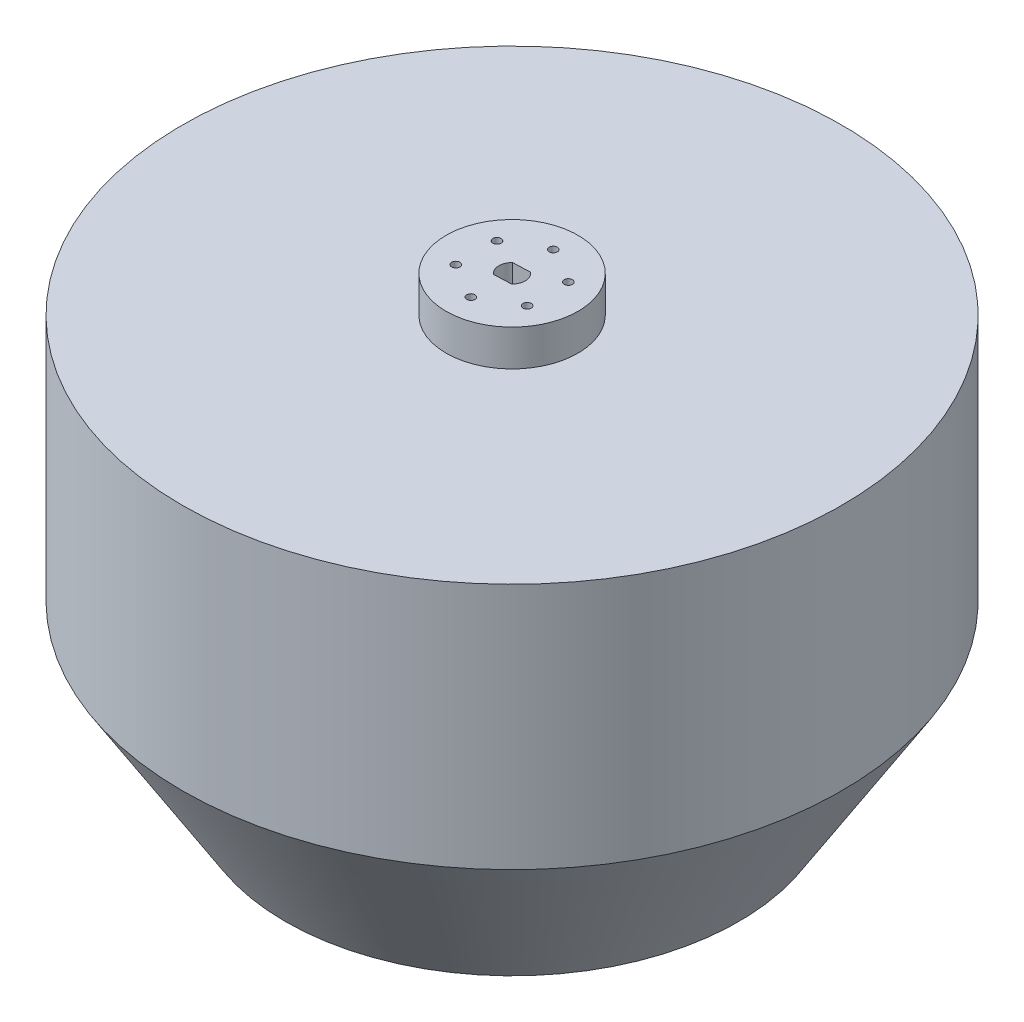
ISO-10303-21;
HEADER;
FILE_DESCRIPTION(('STEP AP214'),'2;1');
FILE_NAME('part.step','',(''),(''),'','','');
FILE_SCHEMA(('AUTOMOTIVE_DESIGN { 1 0 10303 214 1 1 1 1 }'));
ENDSEC;
DATA;
#1=APPLICATION_CONTEXT('core data for automotive mechanical design processes');
#2=APPLICATION_PROTOCOL_DEFINITION('international standard','automotive_design',2000,#1);
#3=PRODUCT_CONTEXT('',#1,'mechanical');
#4=PRODUCT('Part','Part','',(#3));
#5=PRODUCT_RELATED_PRODUCT_CATEGORY('part','',(#4));
#6=PRODUCT_DEFINITION_FORMATION('','',#4);
#7=PRODUCT_DEFINITION_CONTEXT('part definition',#1,'design');
#8=PRODUCT_DEFINITION('design','',#6,#7);
#9=PRODUCT_DEFINITION_SHAPE('','',#8);
#10=(LENGTH_UNIT() NAMED_UNIT(*) SI_UNIT(.MILLI.,.METRE.));
#11=(NAMED_UNIT(*) PLANE_ANGLE_UNIT() SI_UNIT($,.RADIAN.));
#12=(NAMED_UNIT(*) SI_UNIT($,.STERADIAN.) SOLID_ANGLE_UNIT());
#13=UNCERTAINTY_MEASURE_WITH_UNIT(LENGTH_MEASURE(1.E-05),#10,'distance_accuracy_value','');
#14=(GEOMETRIC_REPRESENTATION_CONTEXT(3) GLOBAL_UNCERTAINTY_ASSIGNED_CONTEXT((#13)) GLOBAL_UNIT_ASSIGNED_CONTEXT((#10,
#11,#12)) REPRESENTATION_CONTEXT('',''));
#15=CARTESIAN_POINT('',(0.,0.,0.));
#16=DIRECTION('',(0.,0.,1.));
#17=DIRECTION('',(1.,0.,0.));
#18=AXIS2_PLACEMENT_3D('',#15,#16,#17);
#19=CARTESIAN_POINT('',(0.,57.3492996881719,0.));
#20=DIRECTION('',(0.,1.,0.));
#21=DIRECTION('',(0.,0.,1.));
#22=AXIS2_PLACEMENT_3D('',#19,#20,#21);
#23=CYLINDRICAL_SURFACE('',#22,97.5);
#24=CARTESIAN_POINT('',(0.,11.2433603046011,0.));
#25=DIRECTION('',(0.,-1.,0.));
#26=DIRECTION('',(0.,0.,-1.));
#27=AXIS2_PLACEMENT_3D('',#24,#25,#26);
#28=CIRCLE('',#27,97.5);
#29=CARTESIAN_POINT('',(0.,11.2433603046011,-97.5));
#30=VERTEX_POINT('',#29);
#31=EDGE_CURVE('E157',#30,#30,#28,.T.);
#32=ORIENTED_EDGE('',*,*,#31,.F.);
#33=EDGE_LOOP('',(#32));
#34=FACE_BOUND('',#33,.T.);
#35=CARTESIAN_POINT('',(0.,25.2294928136093,0.));
#36=DIRECTION('',(0.,1.,0.));
#37=DIRECTION('',(0.,0.,1.));
#38=AXIS2_PLACEMENT_3D('',#35,#36,#37);
#39=CIRCLE('',#38,97.5);
#40=CARTESIAN_POINT('',(0.,25.2294928136093,97.5));
#41=VERTEX_POINT('',#40);
#42=EDGE_CURVE('E167',#41,#41,#39,.T.);
#43=ORIENTED_EDGE('',*,*,#42,.F.);
#44=EDGE_LOOP('',(#43));
#45=FACE_BOUND('',#44,.T.);
#46=ADVANCED_FACE('F37',(#34,#45),#23,.T.);
#47=CARTESIAN_POINT('',(0.,45.2294928136093,0.));
#48=DIRECTION('',(0.,1.,0.));
#49=DIRECTION('',(0.,0.,1.));
#50=AXIS2_PLACEMENT_3D('',#47,#48,#49);
#51=PLANE('',#50);
#52=CARTESIAN_POINT('',(0.,45.2294928136093,0.));
#53=DIRECTION('',(0.,1.,0.));
#54=DIRECTION('',(0.,0.,1.));
#55=AXIS2_PLACEMENT_3D('',#52,#53,#54);
#56=CIRCLE('',#55,40.);
#57=CARTESIAN_POINT('',(0.,45.2294928136093,40.));
#58=VERTEX_POINT('',#57);
#59=EDGE_CURVE('E11',#58,#58,#56,.T.);
#60=ORIENTED_EDGE('',*,*,#59,.F.);
#61=EDGE_LOOP('',(#60));
#62=FACE_BOUND('',#61,.T.);
#63=CARTESIAN_POINT('',(0.,45.2294928136093,0.));
#64=DIRECTION('',(0.,1.,0.));
#65=DIRECTION('',(0.,0.,1.));
#66=AXIS2_PLACEMENT_3D('',#63,#64,#65);
#67=CIRCLE('',#66,200.);
#68=CARTESIAN_POINT('',(0.,45.2294928136093,200.));
#69=VERTEX_POINT('',#68);
#70=EDGE_CURVE('E46',#69,#69,#67,.T.);
#71=ORIENTED_EDGE('',*,*,#70,.T.);
#72=EDGE_LOOP('',(#71));
#73=FACE_BOUND('',#72,.T.);
#74=ADVANCED_FACE('F39',(#62,#73),#51,.T.);
#75=CARTESIAN_POINT('',(0.,57.3492996881719,0.));
#76=DIRECTION('',(0.,1.,0.));
#77=DIRECTION('',(0.,0.,1.));
#78=AXIS2_PLACEMENT_3D('',#75,#76,#77);
#79=CYLINDRICAL_SURFACE('',#78,200.);
#80=CARTESIAN_POINT('',(0.,-104.770507186391,0.));
#81=DIRECTION('',(0.,1.,0.));
#82=DIRECTION('',(0.,0.,1.));
#83=AXIS2_PLACEMENT_3D('',#80,#81,#82);
#84=CIRCLE('',#83,200.);
#85=CARTESIAN_POINT('',(0.,-104.770507186391,200.));
#86=VERTEX_POINT('',#85);
#87=EDGE_CURVE('E182',#86,#86,#84,.T.);
#88=ORIENTED_EDGE('',*,*,#87,.T.);
#89=EDGE_LOOP('',(#88));
#90=FACE_BOUND('',#89,.T.);
#91=ORIENTED_EDGE('',*,*,#70,.F.);
#92=EDGE_LOOP('',(#91));
#93=FACE_BOUND('',#92,.T.);
#94=ADVANCED_FACE('F225',(#90,#93),#79,.T.);
#95=CARTESIAN_POINT('',(0.,-104.770507186391,0.));
#96=DIRECTION('',(0.,1.,0.));
#97=DIRECTION('',(0.,0.,1.));
#98=AXIS2_PLACEMENT_3D('',#95,#96,#97);
#99=CONICAL_SURFACE('',#98,200.,0.558599315343562);
#100=CARTESIAN_POINT('',(0.,-204.770507186391,0.));
#101=DIRECTION('',(0.,1.,0.));
#102=DIRECTION('',(0.,0.,1.));
#103=AXIS2_PLACEMENT_3D('',#100,#101,#102);
#104=CIRCLE('',#103,137.5);
#105=CARTESIAN_POINT('',(0.,-204.770507186391,137.5));
#106=VERTEX_POINT('',#105);
#107=EDGE_CURVE('E179',#106,#106,#104,.T.);
#108=ORIENTED_EDGE('',*,*,#107,.T.);
#109=EDGE_LOOP('',(#108));
#110=FACE_BOUND('',#109,.T.);
#111=ORIENTED_EDGE('',*,*,#87,.F.);
#112=EDGE_LOOP('',(#111));
#113=FACE_BOUND('',#112,.T.);
#114=ADVANCED_FACE('F219',(#110,#113),#99,.T.);
#115=CARTESIAN_POINT('',(-137.5,-204.770507186391,0.));
#116=DIRECTION('',(0.,-1.,0.));
#117=DIRECTION('',(0.,0.,-1.));
#118=AXIS2_PLACEMENT_3D('',#115,#116,#117);
#119=PLANE('',#118);
#120=CARTESIAN_POINT('',(0.,-204.770507186391,0.));
#121=DIRECTION('',(0.,1.,0.));
#122=DIRECTION('',(0.,0.,1.));
#123=AXIS2_PLACEMENT_3D('',#120,#121,#122);
#124=CIRCLE('',#123,117.5);
#125=CARTESIAN_POINT('',(0.,-204.770507186391,117.5));
#126=VERTEX_POINT('',#125);
#127=EDGE_CURVE('E176',#126,#126,#124,.T.);
#128=ORIENTED_EDGE('',*,*,#127,.T.);
#129=EDGE_LOOP('',(#128));
#130=FACE_BOUND('',#129,.T.);
#131=ORIENTED_EDGE('',*,*,#107,.F.);
#132=EDGE_LOOP('',(#131));
#133=FACE_BOUND('',#132,.T.);
#134=ADVANCED_FACE('F213',(#130,#133),#119,.T.);
#135=CARTESIAN_POINT('',(0.,-204.770507186391,0.));
#136=DIRECTION('',(0.,1.,0.));
#137=DIRECTION('',(0.,0.,1.));
#138=AXIS2_PLACEMENT_3D('',#135,#136,#137);
#139=CONICAL_SURFACE('',#138,117.5,0.558599315343563);
#140=CARTESIAN_POINT('',(0.,-104.770507186391,0.));
#141=DIRECTION('',(0.,1.,0.));
#142=DIRECTION('',(0.,0.,1.));
#143=AXIS2_PLACEMENT_3D('',#140,#141,#142);
#144=CIRCLE('',#143,180.);
#145=CARTESIAN_POINT('',(0.,-104.770507186391,180.));
#146=VERTEX_POINT('',#145);
#147=EDGE_CURVE('E173',#146,#146,#144,.T.);
#148=ORIENTED_EDGE('',*,*,#147,.T.);
#149=EDGE_LOOP('',(#148));
#150=FACE_BOUND('',#149,.T.);
#151=ORIENTED_EDGE('',*,*,#127,.F.);
#152=EDGE_LOOP('',(#151));
#153=FACE_BOUND('',#152,.T.);
#154=ADVANCED_FACE('F207',(#150,#153),#139,.F.);
#155=CARTESIAN_POINT('',(0.,57.3492996881719,0.));
#156=DIRECTION('',(0.,1.,0.));
#157=DIRECTION('',(0.,0.,1.));
#158=AXIS2_PLACEMENT_3D('',#155,#156,#157);
#159=CYLINDRICAL_SURFACE('',#158,180.);
#160=CARTESIAN_POINT('',(0.,25.2294928136093,0.));
#161=DIRECTION('',(0.,1.,0.));
#162=DIRECTION('',(0.,0.,1.));
#163=AXIS2_PLACEMENT_3D('',#160,#161,#162);
#164=CIRCLE('',#163,180.);
#165=CARTESIAN_POINT('',(0.,25.2294928136093,180.));
#166=VERTEX_POINT('',#165);
#167=EDGE_CURVE('E170',#166,#166,#164,.T.);
#168=ORIENTED_EDGE('',*,*,#167,.T.);
#169=EDGE_LOOP('',(#168));
#170=FACE_BOUND('',#169,.T.);
#171=ORIENTED_EDGE('',*,*,#147,.F.);
#172=EDGE_LOOP('',(#171));
#173=FACE_BOUND('',#172,.T.);
#174=ADVANCED_FACE('F201',(#170,#173),#159,.F.);
#175=CARTESIAN_POINT('',(-180.,25.2294928136093,0.));
#176=DIRECTION('',(0.,-1.,0.));
#177=DIRECTION('',(0.,0.,-1.));
#178=AXIS2_PLACEMENT_3D('',#175,#176,#177);
#179=PLANE('',#178);
#180=ORIENTED_EDGE('',*,*,#42,.T.);
#181=EDGE_LOOP('',(#180));
#182=FACE_BOUND('',#181,.T.);
#183=ORIENTED_EDGE('',*,*,#167,.F.);
#184=EDGE_LOOP('',(#183));
#185=FACE_BOUND('',#184,.T.);
#186=ADVANCED_FACE('F198',(#182,#185),#179,.T.);
#187=CARTESIAN_POINT('',(0.,4.25029405009688,0.));
#188=DIRECTION('',(0.,1.,0.));
#189=DIRECTION('',(0.,0.,1.));
#190=AXIS2_PLACEMENT_3D('',#187,#188,#189);
#191=TOROIDAL_SURFACE('',#190,107.860840909893,12.5);
#192=ORIENTED_EDGE('',*,*,#31,.T.);
#193=EDGE_LOOP('',(#192));
#194=FACE_BOUND('',#193,.T.);
#195=CARTESIAN_POINT('',(0.,-2.7427722044073,0.));
#196=DIRECTION('',(0.,1.,0.));
#197=DIRECTION('',(0.,0.,1.));
#198=AXIS2_PLACEMENT_3D('',#195,#196,#197);
#199=CIRCLE('',#198,97.5);
#200=CARTESIAN_POINT('',(0.,-2.7427722044073,97.5));
#201=VERTEX_POINT('',#200);
#202=EDGE_CURVE('E158',#201,#201,#199,.T.);
#203=ORIENTED_EDGE('',*,*,#202,.T.);
#204=EDGE_LOOP('',(#203));
#205=FACE_BOUND('',#204,.T.);
#206=ADVANCED_FACE('F189',(#194,#205),#191,.F.);
#207=CARTESIAN_POINT('',(0.,-9.73583845891146,0.));
#208=DIRECTION('',(0.,1.,0.));
#209=DIRECTION('',(0.,0.,1.));
#210=AXIS2_PLACEMENT_3D('',#207,#208,#209);
#211=TOROIDAL_SURFACE('',#210,107.860840909893,12.5);
#212=ORIENTED_EDGE('',*,*,#202,.F.);
#213=EDGE_LOOP('',(#212));
#214=FACE_BOUND('',#213,.T.);
#215=CARTESIAN_POINT('',(0.,-16.7289047134156,0.));
#216=DIRECTION('',(0.,-1.,0.));
#217=DIRECTION('',(0.,0.,-1.));
#218=AXIS2_PLACEMENT_3D('',#215,#216,#217);
#219=CIRCLE('',#218,97.5000000000001);
#220=CARTESIAN_POINT('',(0.,-16.7289047134156,-97.5000000000001));
#221=VERTEX_POINT('',#220);
#222=EDGE_CURVE('E154',#221,#221,#219,.T.);
#223=ORIENTED_EDGE('',*,*,#222,.F.);
#224=EDGE_LOOP('',(#223));
#225=FACE_BOUND('',#224,.T.);
#226=ADVANCED_FACE('F318',(#214,#225),#211,.F.);
#227=CARTESIAN_POINT('',(0.,-23.7219709679198,0.));
#228=DIRECTION('',(0.,1.,0.));
#229=DIRECTION('',(0.,0.,1.));
#230=AXIS2_PLACEMENT_3D('',#227,#228,#229);
#231=TOROIDAL_SURFACE('',#230,107.860840909893,12.5);
#232=ORIENTED_EDGE('',*,*,#222,.T.);
#233=EDGE_LOOP('',(#232));
#234=FACE_BOUND('',#233,.T.);
#235=CARTESIAN_POINT('',(0.,-30.715037222424,0.));
#236=DIRECTION('',(0.,1.,0.));
#237=DIRECTION('',(0.,0.,1.));
#238=AXIS2_PLACEMENT_3D('',#235,#236,#237);
#239=CIRCLE('',#238,97.5);
#240=CARTESIAN_POINT('',(0.,-30.715037222424,97.5));
#241=VERTEX_POINT('',#240);
#242=EDGE_CURVE('E161',#241,#241,#239,.T.);
#243=ORIENTED_EDGE('',*,*,#242,.T.);
#244=EDGE_LOOP('',(#243));
#245=FACE_BOUND('',#244,.T.);
#246=ADVANCED_FACE('F321',(#234,#245),#231,.F.);
#247=CARTESIAN_POINT('',(0.,-37.7081034769281,0.));
#248=DIRECTION('',(0.,1.,0.));
#249=DIRECTION('',(0.,0.,1.));
#250=AXIS2_PLACEMENT_3D('',#247,#248,#249);
#251=TOROIDAL_SURFACE('',#250,107.860840909893,12.5);
#252=ORIENTED_EDGE('',*,*,#242,.F.);
#253=EDGE_LOOP('',(#252));
#254=FACE_BOUND('',#253,.T.);
#255=CARTESIAN_POINT('',(0.,-44.7011697314323,0.));
#256=DIRECTION('',(0.,1.,0.));
#257=DIRECTION('',(0.,0.,1.));
#258=AXIS2_PLACEMENT_3D('',#255,#256,#257);
#259=CIRCLE('',#258,97.5);
#260=CARTESIAN_POINT('',(0.,-44.7011697314323,97.5));
#261=VERTEX_POINT('',#260);
#262=EDGE_CURVE('E146',#261,#261,#259,.T.);
#263=ORIENTED_EDGE('',*,*,#262,.T.);
#264=EDGE_LOOP('',(#263));
#265=FACE_BOUND('',#264,.T.);
#266=ADVANCED_FACE('F305',(#254,#265),#251,.F.);
#267=CARTESIAN_POINT('',(0.,-51.6942359859364,0.));
#268=DIRECTION('',(0.,1.,0.));
#269=DIRECTION('',(0.,0.,1.));
#270=AXIS2_PLACEMENT_3D('',#267,#268,#269);
#271=TOROIDAL_SURFACE('',#270,107.860840909893,12.5);
#272=ORIENTED_EDGE('',*,*,#262,.F.);
#273=EDGE_LOOP('',(#272));
#274=FACE_BOUND('',#273,.T.);
#275=CARTESIAN_POINT('',(0.,-58.6873022404406,0.));
#276=DIRECTION('',(0.,1.,0.));
#277=DIRECTION('',(0.,0.,1.));
#278=AXIS2_PLACEMENT_3D('',#275,#276,#277);
#279=CIRCLE('',#278,97.5);
#280=CARTESIAN_POINT('',(0.,-58.6873022404406,97.5));
#281=VERTEX_POINT('',#280);
#282=EDGE_CURVE('E143',#281,#281,#279,.T.);
#283=ORIENTED_EDGE('',*,*,#282,.T.);
#284=EDGE_LOOP('',(#283));
#285=FACE_BOUND('',#284,.T.);
#286=ADVANCED_FACE('F301',(#274,#285),#271,.F.);
#287=CARTESIAN_POINT('',(0.,-65.6803684949447,0.));
#288=DIRECTION('',(0.,1.,0.));
#289=DIRECTION('',(0.,0.,1.));
#290=AXIS2_PLACEMENT_3D('',#287,#288,#289);
#291=TOROIDAL_SURFACE('',#290,107.860840909893,12.5);
#292=ORIENTED_EDGE('',*,*,#282,.F.);
#293=EDGE_LOOP('',(#292));
#294=FACE_BOUND('',#293,.T.);
#295=CARTESIAN_POINT('',(0.,-72.6734347494489,0.));
#296=DIRECTION('',(0.,1.,0.));
#297=DIRECTION('',(0.,0.,1.));
#298=AXIS2_PLACEMENT_3D('',#295,#296,#297);
#299=CIRCLE('',#298,97.5);
#300=CARTESIAN_POINT('',(0.,-72.6734347494489,97.5));
#301=VERTEX_POINT('',#300);
#302=EDGE_CURVE('E142',#301,#301,#299,.T.);
#303=ORIENTED_EDGE('',*,*,#302,.T.);
#304=EDGE_LOOP('',(#303));
#305=FACE_BOUND('',#304,.T.);
#306=ADVANCED_FACE('F304',(#294,#305),#291,.F.);
#307=CARTESIAN_POINT('',(0.,-93.6526335129613,0.));
#308=DIRECTION('',(0.,1.,0.));
#309=DIRECTION('',(0.,0.,1.));
#310=AXIS2_PLACEMENT_3D('',#307,#308,#309);
#311=TOROIDAL_SURFACE('',#310,107.860840909893,12.5);
#312=CARTESIAN_POINT('',(0.,-100.645699767465,0.));
#313=DIRECTION('',(0.,1.,0.));
#314=DIRECTION('',(0.,0.,1.));
#315=AXIS2_PLACEMENT_3D('',#312,#313,#314);
#316=CIRCLE('',#315,97.5);
#317=CARTESIAN_POINT('',(0.,-100.645699767465,97.5));
#318=VERTEX_POINT('',#317);
#319=EDGE_CURVE('E41',#318,#318,#316,.T.);
#320=ORIENTED_EDGE('',*,*,#319,.T.);
#321=EDGE_LOOP('',(#320));
#322=FACE_BOUND('',#321,.T.);
#323=CARTESIAN_POINT('',(0.,-86.6595672584572,0.));
#324=DIRECTION('',(0.,1.,0.));
#325=DIRECTION('',(0.,0.,1.));
#326=AXIS2_PLACEMENT_3D('',#323,#324,#325);
#327=CIRCLE('',#326,97.5);
#328=CARTESIAN_POINT('',(0.,-86.6595672584572,97.5));
#329=VERTEX_POINT('',#328);
#330=EDGE_CURVE('E149',#329,#329,#327,.T.);
#331=ORIENTED_EDGE('',*,*,#330,.F.);
#332=EDGE_LOOP('',(#331));
#333=FACE_BOUND('',#332,.T.);
#334=ADVANCED_FACE('F307',(#322,#333),#311,.F.);
#335=CARTESIAN_POINT('',(0.,-79.666501003953,0.));
#336=DIRECTION('',(0.,1.,0.));
#337=DIRECTION('',(0.,0.,1.));
#338=AXIS2_PLACEMENT_3D('',#335,#336,#337);
#339=TOROIDAL_SURFACE('',#338,107.860840909893,12.5);
#340=ORIENTED_EDGE('',*,*,#302,.F.);
#341=EDGE_LOOP('',(#340));
#342=FACE_BOUND('',#341,.T.);
#343=ORIENTED_EDGE('',*,*,#330,.T.);
#344=EDGE_LOOP('',(#343));
#345=FACE_BOUND('',#344,.T.);
#346=ADVANCED_FACE('F310',(#342,#345),#339,.F.);
#347=ORIENTED_EDGE('',*,*,#319,.F.);
#348=EDGE_LOOP('',(#347));
#349=FACE_BOUND('',#348,.T.);
#350=CARTESIAN_POINT('',(0.,-104.770507186391,0.));
#351=DIRECTION('',(0.,-1.,0.));
#352=DIRECTION('',(0.,0.,-1.));
#353=AXIS2_PLACEMENT_3D('',#350,#351,#352);
#354=CIRCLE('',#353,97.5);
#355=CARTESIAN_POINT('',(0.,-104.770507186391,-97.5));
#356=VERTEX_POINT('',#355);
#357=EDGE_CURVE('E139',#356,#356,#354,.T.);
#358=ORIENTED_EDGE('',*,*,#357,.F.);
#359=EDGE_LOOP('',(#358));
#360=FACE_BOUND('',#359,.T.);
#361=ADVANCED_FACE('F195',(#349,#360),#23,.T.);
#362=CARTESIAN_POINT('',(0.,-117.117992442394,0.));
#363=DIRECTION('',(0.,1.,0.));
#364=DIRECTION('',(0.,0.,1.));
#365=AXIS2_PLACEMENT_3D('',#362,#363,#364);
#366=TOROIDAL_SURFACE('',#365,99.4466915145426,12.5);
#367=ORIENTED_EDGE('',*,*,#357,.T.);
#368=EDGE_LOOP('',(#367));
#369=FACE_BOUND('',#368,.T.);
#370=CARTESIAN_POINT('',(0.,-120.77885315948,0.));
#371=DIRECTION('',(0.,1.,0.));
#372=DIRECTION('',(0.,0.,1.));
#373=AXIS2_PLACEMENT_3D('',#370,#371,#372);
#374=CIRCLE('',#373,87.4947837668191);
#375=CARTESIAN_POINT('',(0.,-120.77885315948,87.4947837668191));
#376=VERTEX_POINT('',#375);
#377=EDGE_CURVE('E133',#376,#376,#374,.T.);
#378=ORIENTED_EDGE('',*,*,#377,.T.);
#379=EDGE_LOOP('',(#378));
#380=FACE_BOUND('',#379,.T.);
#381=ADVANCED_FACE('F290',(#369,#380),#366,.F.);
#382=CARTESIAN_POINT('',(0.,-133.126338415483,0.));
#383=DIRECTION('',(0.,1.,0.));
#384=DIRECTION('',(0.,0.,1.));
#385=AXIS2_PLACEMENT_3D('',#382,#383,#384);
#386=TOROIDAL_SURFACE('',#385,89.4414752813618,12.5);
#387=ORIENTED_EDGE('',*,*,#377,.F.);
#388=EDGE_LOOP('',(#387));
#389=FACE_BOUND('',#388,.T.);
#390=CARTESIAN_POINT('',(0.,-136.787199132569,0.));
#391=DIRECTION('',(0.,1.,0.));
#392=DIRECTION('',(0.,0.,1.));
#393=AXIS2_PLACEMENT_3D('',#390,#391,#392);
#394=CIRCLE('',#393,77.4895675336383);
#395=CARTESIAN_POINT('',(0.,-136.787199132569,77.4895675336383));
#396=VERTEX_POINT('',#395);
#397=EDGE_CURVE('E136',#396,#396,#394,.T.);
#398=ORIENTED_EDGE('',*,*,#397,.T.);
#399=EDGE_LOOP('',(#398));
#400=FACE_BOUND('',#399,.T.);
#401=ADVANCED_FACE('F287',(#389,#400),#386,.F.);
#402=CARTESIAN_POINT('',(0.,-149.134684388572,0.));
#403=DIRECTION('',(0.,1.,0.));
#404=DIRECTION('',(0.,0.,1.));
#405=AXIS2_PLACEMENT_3D('',#402,#403,#404);
#406=TOROIDAL_SURFACE('',#405,79.436259048181,12.5);
#407=ORIENTED_EDGE('',*,*,#397,.F.);
#408=EDGE_LOOP('',(#407));
#409=FACE_BOUND('',#408,.T.);
#410=CARTESIAN_POINT('',(0.,-152.795545105659,0.));
#411=DIRECTION('',(0.,1.,0.));
#412=DIRECTION('',(0.,0.,1.));
#413=AXIS2_PLACEMENT_3D('',#410,#411,#412);
#414=CIRCLE('',#413,67.4843513004574);
#415=CARTESIAN_POINT('',(0.,-152.795545105659,67.4843513004574));
#416=VERTEX_POINT('',#415);
#417=EDGE_CURVE('E127',#416,#416,#414,.T.);
#418=ORIENTED_EDGE('',*,*,#417,.T.);
#419=EDGE_LOOP('',(#418));
#420=FACE_BOUND('',#419,.T.);
#421=ADVANCED_FACE('F285',(#409,#420),#406,.F.);
#422=CARTESIAN_POINT('',(0.,-165.143030361662,0.));
#423=DIRECTION('',(0.,1.,0.));
#424=DIRECTION('',(0.,0.,1.));
#425=AXIS2_PLACEMENT_3D('',#422,#423,#424);
#426=TOROIDAL_SURFACE('',#425,69.4310428150001,12.5);
#427=ORIENTED_EDGE('',*,*,#417,.F.);
#428=EDGE_LOOP('',(#427));
#429=FACE_BOUND('',#428,.T.);
#430=CARTESIAN_POINT('',(0.,-168.803891078748,0.));
#431=DIRECTION('',(0.,1.,0.));
#432=DIRECTION('',(0.,0.,1.));
#433=AXIS2_PLACEMENT_3D('',#430,#431,#432);
#434=CIRCLE('',#433,57.4791350672766);
#435=CARTESIAN_POINT('',(0.,-168.803891078748,57.4791350672766));
#436=VERTEX_POINT('',#435);
#437=EDGE_CURVE('E130',#436,#436,#434,.T.);
#438=ORIENTED_EDGE('',*,*,#437,.T.);
#439=EDGE_LOOP('',(#438));
#440=FACE_BOUND('',#439,.T.);
#441=ADVANCED_FACE('F282',(#429,#440),#426,.F.);
#442=CARTESIAN_POINT('',(0.,-181.151376334751,0.));
#443=DIRECTION('',(0.,1.,0.));
#444=DIRECTION('',(0.,0.,1.));
#445=AXIS2_PLACEMENT_3D('',#442,#443,#444);
#446=TOROIDAL_SURFACE('',#445,59.4258265818192,12.5);
#447=ORIENTED_EDGE('',*,*,#437,.F.);
#448=EDGE_LOOP('',(#447));
#449=FACE_BOUND('',#448,.T.);
#450=CARTESIAN_POINT('',(0.,-184.812237051837,0.));
#451=DIRECTION('',(0.,1.,0.));
#452=DIRECTION('',(0.,0.,1.));
#453=AXIS2_PLACEMENT_3D('',#450,#451,#452);
#454=CIRCLE('',#453,47.4739188340957);
#455=CARTESIAN_POINT('',(0.,-184.812237051837,47.4739188340957));
#456=VERTEX_POINT('',#455);
#457=EDGE_CURVE('E120',#456,#456,#454,.T.);
#458=ORIENTED_EDGE('',*,*,#457,.T.);
#459=EDGE_LOOP('',(#458));
#460=FACE_BOUND('',#459,.T.);
#461=ADVANCED_FACE('F280',(#449,#460),#446,.F.);
#462=CARTESIAN_POINT('',(0.,-197.15972230784,0.));
#463=DIRECTION('',(0.,1.,0.));
#464=DIRECTION('',(0.,0.,1.));
#465=AXIS2_PLACEMENT_3D('',#462,#463,#464);
#466=TOROIDAL_SURFACE('',#465,49.4206103486384,12.5);
#467=CARTESIAN_POINT('',(0.,-200.820583024927,0.));
#468=DIRECTION('',(0.,1.,0.));
#469=DIRECTION('',(0.,0.,1.));
#470=AXIS2_PLACEMENT_3D('',#467,#468,#469);
#471=CIRCLE('',#470,37.4687026009149);
#472=CARTESIAN_POINT('',(0.,-200.820583024927,37.4687026009149));
#473=VERTEX_POINT('',#472);
#474=EDGE_CURVE('E124',#473,#473,#471,.T.);
#475=ORIENTED_EDGE('',*,*,#474,.T.);
#476=EDGE_LOOP('',(#475));
#477=FACE_BOUND('',#476,.T.);
#478=ORIENTED_EDGE('',*,*,#457,.F.);
#479=EDGE_LOOP('',(#478));
#480=FACE_BOUND('',#479,.T.);
#481=ADVANCED_FACE('F276',(#477,#480),#466,.F.);
#482=CARTESIAN_POINT('',(-35.,-204.770507186391,0.));
#483=DIRECTION('',(0.,-1.,0.));
#484=DIRECTION('',(0.,0.,-1.));
#485=AXIS2_PLACEMENT_3D('',#482,#483,#484);
#486=PLANE('',#485);
#487=CARTESIAN_POINT('',(0.,-204.770507186391,0.));
#488=DIRECTION('',(0.,1.,0.));
#489=DIRECTION('',(0.,0.,1.));
#490=AXIS2_PLACEMENT_3D('',#487,#488,#489);
#491=CIRCLE('',#490,35.);
#492=CARTESIAN_POINT('',(0.,-204.770507186391,35.));
#493=VERTEX_POINT('',#492);
#494=EDGE_CURVE('E164',#493,#493,#491,.T.);
#495=ORIENTED_EDGE('',*,*,#494,.F.);
#496=EDGE_LOOP('',(#495));
#497=FACE_BOUND('',#496,.T.);
#498=ADVANCED_FACE('F279',(#497),#486,.T.);
#499=CARTESIAN_POINT('',(0.,-104.770507186391,0.));
#500=DIRECTION('',(0.,1.,0.));
#501=DIRECTION('',(0.,0.,1.));
#502=AXIS2_PLACEMENT_3D('',#499,#500,#501);
#503=CONICAL_SURFACE('',#502,97.5,0.558599315343563);
#504=ORIENTED_EDGE('',*,*,#474,.F.);
#505=EDGE_LOOP('',(#504));
#506=FACE_BOUND('',#505,.T.);
#507=ORIENTED_EDGE('',*,*,#494,.T.);
#508=EDGE_LOOP('',(#507));
#509=FACE_BOUND('',#508,.T.);
#510=ADVANCED_FACE('F271',(#506,#509),#503,.T.);
#511=CARTESIAN_POINT('',(0.,67.2294928136094,0.));
#512=DIRECTION('',(0.,1.,0.));
#513=DIRECTION('',(0.,0.,1.));
#514=AXIS2_PLACEMENT_3D('',#511,#512,#513);
#515=PLANE('',#514);
#516=CARTESIAN_POINT('',(1.28326169135384E-12,67.2294928136094,-24.9999999999977));
#517=DIRECTION('',(0.,1.,0.));
#518=DIRECTION('',(0.,0.,1.));
#519=AXIS2_PLACEMENT_3D('',#516,#517,#518);
#520=CIRCLE('',#519,2.49999999999875);
#521=CARTESIAN_POINT('',(1.28326169135384E-12,67.2294928136094,-22.499999999999));
#522=VERTEX_POINT('',#521);
#523=EDGE_CURVE('E540',#522,#522,#520,.T.);
#524=ORIENTED_EDGE('',*,*,#523,.F.);
#525=EDGE_LOOP('',(#524));
#526=FACE_BOUND('',#525,.T.);
#527=CARTESIAN_POINT('',(-21.6506350946084,67.2294928136094,-12.4999999999979));
#528=DIRECTION('',(0.,1.,0.));
#529=DIRECTION('',(0.,0.,1.));
#530=AXIS2_PLACEMENT_3D('',#527,#528,#529);
#531=CIRCLE('',#530,2.50000000000107);
#532=CARTESIAN_POINT('',(-21.6506350946084,67.2294928136094,-9.9999999999968));
#533=VERTEX_POINT('',#532);
#534=EDGE_CURVE('E550',#533,#533,#531,.T.);
#535=ORIENTED_EDGE('',*,*,#534,.F.);
#536=EDGE_LOOP('',(#535));
#537=FACE_BOUND('',#536,.T.);
#538=CARTESIAN_POINT('',(-21.6506350946079,67.2294928136094,12.5000000000009));
#539=DIRECTION('',(0.,1.,0.));
#540=DIRECTION('',(0.,0.,1.));
#541=AXIS2_PLACEMENT_3D('',#538,#539,#540);
#542=CIRCLE('',#541,2.5000000000024);
#543=CARTESIAN_POINT('',(-21.6506350946079,67.2294928136094,15.0000000000033));
#544=VERTEX_POINT('',#543);
#545=EDGE_CURVE('E549',#544,#544,#542,.T.);
#546=ORIENTED_EDGE('',*,*,#545,.F.);
#547=EDGE_LOOP('',(#546));
#548=FACE_BOUND('',#547,.T.);
#549=CARTESIAN_POINT('',(2.26418693175979E-12,67.2294928136094,24.9999999999999));
#550=DIRECTION('',(0.,1.,0.));
#551=DIRECTION('',(0.,0.,1.));
#552=AXIS2_PLACEMENT_3D('',#549,#550,#551);
#553=CIRCLE('',#552,2.50000000000167);
#554=CARTESIAN_POINT('',(2.26418693175979E-12,67.2294928136094,27.5000000000016));
#555=VERTEX_POINT('',#554);
#556=EDGE_CURVE('E567',#555,#555,#553,.T.);
#557=ORIENTED_EDGE('',*,*,#556,.F.);
#558=EDGE_LOOP('',(#557));
#559=FACE_BOUND('',#558,.T.);
#560=CARTESIAN_POINT('',(21.6506350946119,67.2294928136094,12.5000000000001));
#561=DIRECTION('',(0.,1.,0.));
#562=DIRECTION('',(0.,0.,1.));
#563=AXIS2_PLACEMENT_3D('',#560,#561,#562);
#564=CIRCLE('',#563,2.49999999999958);
#565=CARTESIAN_POINT('',(21.6506350946119,67.2294928136094,14.9999999999996));
#566=VERTEX_POINT('',#565);
#567=EDGE_CURVE('E561',#566,#566,#564,.T.);
#568=ORIENTED_EDGE('',*,*,#567,.F.);
#569=EDGE_LOOP('',(#568));
#570=FACE_BOUND('',#569,.T.);
#571=CARTESIAN_POINT('',(21.6506350946114,67.2294928136094,-12.4999999999987));
#572=DIRECTION('',(0.,1.,0.));
#573=DIRECTION('',(0.,0.,1.));
#574=AXIS2_PLACEMENT_3D('',#571,#572,#573);
#575=CIRCLE('',#574,2.49999999999814);
#576=CARTESIAN_POINT('',(21.6506350946114,67.2294928136094,-10.0000000000006));
#577=VERTEX_POINT('',#576);
#578=EDGE_CURVE('E555',#577,#577,#575,.T.);
#579=ORIENTED_EDGE('',*,*,#578,.F.);
#580=EDGE_LOOP('',(#579));
#581=FACE_BOUND('',#580,.T.);
#582=CARTESIAN_POINT('',(0.,67.2294928136094,0.));
#583=DIRECTION('',(0.,1.,0.));
#584=DIRECTION('',(0.,0.,1.));
#585=AXIS2_PLACEMENT_3D('',#582,#583,#584);
#586=CIRCLE('',#585,40.);
#587=CARTESIAN_POINT('',(0.,67.2294928136094,40.));
#588=VERTEX_POINT('',#587);
#589=EDGE_CURVE('E95',#588,#588,#586,.T.);
#590=ORIENTED_EDGE('',*,*,#589,.T.);
#591=EDGE_LOOP('',(#590));
#592=FACE_BOUND('',#591,.T.);
#593=DIRECTION('',(0.999231298525374,0.,-0.0392021944193863));
#594=VECTOR('',#593,1.);
#595=CARTESIAN_POINT('',(5.52264820277606,67.2294928136094,5.78794927658744));
#596=LINE('',#595,#594);
#597=CARTESIAN_POINT('',(-5.05222186974509,67.2294928136094,6.20282630571424));
#598=VERTEX_POINT('',#597);
#599=CARTESIAN_POINT('',(5.52264820277681,67.2294928136094,5.78794927658822));
#600=VERTEX_POINT('',#599);
#601=EDGE_CURVE('E87',#598,#600,#596,.T.);
#602=ORIENTED_EDGE('',*,*,#601,.F.);
#603=CARTESIAN_POINT('',(0.,67.2294928136094,0.));
#604=DIRECTION('',(0.,1.,0.));
#605=DIRECTION('',(0.,0.,1.));
#606=AXIS2_PLACEMENT_3D('',#603,#604,#605);
#607=CIRCLE('',#606,8.00000000000053);
#608=CARTESIAN_POINT('',(-5.52264820277773,67.2294928136094,-5.78794927659025));
#609=VERTEX_POINT('',#608);
#610=EDGE_CURVE('E79',#609,#598,#607,.T.);
#611=ORIENTED_EDGE('',*,*,#610,.F.);
#612=DIRECTION('',(-0.999231298525374,0.,0.0392021944193863));
#613=VECTOR('',#612,1.);
#614=CARTESIAN_POINT('',(-5.52264820277773,67.2294928136094,-5.78794927659025));
#615=LINE('',#614,#613);
#616=CARTESIAN_POINT('',(5.05222186974343,67.2294928136094,-6.20282630571705));
#617=VERTEX_POINT('',#616);
#618=EDGE_CURVE('E102',#617,#609,#615,.T.);
#619=ORIENTED_EDGE('',*,*,#618,.F.);
#620=CARTESIAN_POINT('',(0.,67.2294928136094,0.));
#621=DIRECTION('',(0.,1.,0.));
#622=DIRECTION('',(0.,0.,1.));
#623=AXIS2_PLACEMENT_3D('',#620,#621,#622);
#624=CIRCLE('',#623,7.9999999999995);
#625=EDGE_CURVE('E100',#600,#617,#624,.T.);
#626=ORIENTED_EDGE('',*,*,#625,.F.);
#627=EDGE_LOOP('',(#602,#611,#619,#626));
#628=FACE_BOUND('',#627,.T.);
#629=ADVANCED_FACE('F99',(#526,#537,#548,#559,#570,#581,#592,#628),#515,.T.);
#630=CARTESIAN_POINT('',(0.,67.2294928136094,0.));
#631=DIRECTION('',(0.,-1.,0.));
#632=DIRECTION('',(0.,0.,-1.));
#633=AXIS2_PLACEMENT_3D('',#630,#631,#632);
#634=CYLINDRICAL_SURFACE('',#633,40.);
#635=ORIENTED_EDGE('',*,*,#589,.F.);
#636=EDGE_LOOP('',(#635));
#637=FACE_BOUND('',#636,.T.);
#638=ORIENTED_EDGE('',*,*,#59,.T.);
#639=EDGE_LOOP('',(#638));
#640=FACE_BOUND('',#639,.T.);
#641=ADVANCED_FACE('F268',(#637,#640),#634,.T.);
#642=CARTESIAN_POINT('',(0.,67.2294928136094,0.));
#643=DIRECTION('',(0.,-1.,0.));
#644=DIRECTION('',(0.,0.,-1.));
#645=AXIS2_PLACEMENT_3D('',#642,#643,#644);
#646=CYLINDRICAL_SURFACE('',#645,8.00000000000053);
#647=CARTESIAN_POINT('',(0.,45.2294928136093,0.));
#648=DIRECTION('',(0.,1.,0.));
#649=DIRECTION('',(0.,0.,1.));
#650=AXIS2_PLACEMENT_3D('',#647,#648,#649);
#651=CIRCLE('',#650,8.00000000000053);
#652=CARTESIAN_POINT('',(-5.52264820277773,45.2294928136093,-5.78794927659025));
#653=VERTEX_POINT('',#652);
#654=CARTESIAN_POINT('',(-5.05222186974509,45.2294928136093,6.20282630571424));
#655=VERTEX_POINT('',#654);
#656=EDGE_CURVE('E107',#653,#655,#651,.T.);
#657=ORIENTED_EDGE('',*,*,#656,.F.);
#658=DIRECTION('',(0.,-1.,0.));
#659=VECTOR('',#658,1.);
#660=CARTESIAN_POINT('',(-5.52264820277773,67.2294928136094,-5.78794927659025));
#661=LINE('',#660,#659);
#662=EDGE_CURVE('E54',#609,#653,#661,.T.);
#663=ORIENTED_EDGE('',*,*,#662,.F.);
#664=ORIENTED_EDGE('',*,*,#610,.T.);
#665=DIRECTION('',(0.,-1.,0.));
#666=VECTOR('',#665,1.);
#667=CARTESIAN_POINT('',(-5.05222186974509,67.2294928136094,6.20282630571424));
#668=LINE('',#667,#666);
#669=EDGE_CURVE('E82',#598,#655,#668,.T.);
#670=ORIENTED_EDGE('',*,*,#669,.T.);
#671=EDGE_LOOP('',(#657,#663,#664,#670));
#672=FACE_BOUND('',#671,.T.);
#673=ADVANCED_FACE('F81',(#672),#646,.F.);
#674=CARTESIAN_POINT('',(5.52264820277606,67.2294928136094,5.78794927658744));
#675=DIRECTION('',(-0.0392021944193863,0.,-0.999231298525374));
#676=DIRECTION('',(-0.999231298525374,0.,0.0392021944193863));
#677=AXIS2_PLACEMENT_3D('',#674,#675,#676);
#678=PLANE('',#677);
#679=DIRECTION('',(0.999231298525374,0.,-0.0392021944193863));
#680=VECTOR('',#679,1.);
#681=CARTESIAN_POINT('',(5.52264820277606,45.2294928136093,5.78794927658744));
#682=LINE('',#681,#680);
#683=CARTESIAN_POINT('',(5.52264820277681,45.2294928136093,5.78794927658822));
#684=VERTEX_POINT('',#683);
#685=EDGE_CURVE('E94',#655,#684,#682,.T.);
#686=ORIENTED_EDGE('',*,*,#685,.F.);
#687=ORIENTED_EDGE('',*,*,#669,.F.);
#688=ORIENTED_EDGE('',*,*,#601,.T.);
#689=DIRECTION('',(0.,-1.,0.));
#690=VECTOR('',#689,1.);
#691=CARTESIAN_POINT('',(5.52264820277681,67.2294928136094,5.78794927658822));
#692=LINE('',#691,#690);
#693=EDGE_CURVE('E96',#600,#684,#692,.T.);
#694=ORIENTED_EDGE('',*,*,#693,.T.);
#695=EDGE_LOOP('',(#686,#687,#688,#694));
#696=FACE_BOUND('',#695,.T.);
#697=ADVANCED_FACE('F91',(#696),#678,.T.);
#698=CARTESIAN_POINT('',(0.,67.2294928136094,0.));
#699=DIRECTION('',(0.,-1.,0.));
#700=DIRECTION('',(0.,0.,-1.));
#701=AXIS2_PLACEMENT_3D('',#698,#699,#700);
#702=CYLINDRICAL_SURFACE('',#701,7.9999999999995);
#703=CARTESIAN_POINT('',(0.,45.2294928136093,0.));
#704=DIRECTION('',(0.,1.,0.));
#705=DIRECTION('',(0.,0.,1.));
#706=AXIS2_PLACEMENT_3D('',#703,#704,#705);
#707=CIRCLE('',#706,7.9999999999995);
#708=CARTESIAN_POINT('',(5.05222186974343,45.2294928136093,-6.20282630571705));
#709=VERTEX_POINT('',#708);
#710=EDGE_CURVE('E111',#684,#709,#707,.T.);
#711=ORIENTED_EDGE('',*,*,#710,.F.);
#712=ORIENTED_EDGE('',*,*,#693,.F.);
#713=ORIENTED_EDGE('',*,*,#625,.T.);
#714=DIRECTION('',(0.,-1.,0.));
#715=VECTOR('',#714,1.);
#716=CARTESIAN_POINT('',(5.05222186974343,67.2294928136094,-6.20282630571705));
#717=LINE('',#716,#715);
#718=EDGE_CURVE('E59',#617,#709,#717,.T.);
#719=ORIENTED_EDGE('',*,*,#718,.T.);
#720=EDGE_LOOP('',(#711,#712,#713,#719));
#721=FACE_BOUND('',#720,.T.);
#722=ADVANCED_FACE('F254',(#721),#702,.F.);
#723=CARTESIAN_POINT('',(-5.52264820277773,67.2294928136094,-5.78794927659025));
#724=DIRECTION('',(0.0392021944193863,0.,0.999231298525374));
#725=DIRECTION('',(0.999231298525374,0.,-0.0392021944193863));
#726=AXIS2_PLACEMENT_3D('',#723,#724,#725);
#727=PLANE('',#726);
#728=DIRECTION('',(-0.999231298525374,0.,0.0392021944193863));
#729=VECTOR('',#728,1.);
#730=CARTESIAN_POINT('',(-5.52264820277773,45.2294928136093,-5.78794927659025));
#731=LINE('',#730,#729);
#732=EDGE_CURVE('E88',#709,#653,#731,.T.);
#733=ORIENTED_EDGE('',*,*,#732,.F.);
#734=ORIENTED_EDGE('',*,*,#718,.F.);
#735=ORIENTED_EDGE('',*,*,#618,.T.);
#736=ORIENTED_EDGE('',*,*,#662,.T.);
#737=EDGE_LOOP('',(#733,#734,#735,#736));
#738=FACE_BOUND('',#737,.T.);
#739=ADVANCED_FACE('F243',(#738),#727,.T.);
#740=ORIENTED_EDGE('',*,*,#732,.T.);
#741=ORIENTED_EDGE('',*,*,#656,.T.);
#742=ORIENTED_EDGE('',*,*,#685,.T.);
#743=ORIENTED_EDGE('',*,*,#710,.T.);
#744=EDGE_LOOP('',(#740,#741,#742,#743));
#745=FACE_BOUND('',#744,.T.);
#746=ADVANCED_FACE('F235',(#745),#51,.T.);
#747=CARTESIAN_POINT('',(21.6506350946114,52.2294928136094,-12.4999999999987));
#748=DIRECTION('',(0.,1.,0.));
#749=DIRECTION('',(0.,0.,1.));
#750=AXIS2_PLACEMENT_3D('',#747,#748,#749);
#751=CYLINDRICAL_SURFACE('',#750,2.49999999999814);
#752=CARTESIAN_POINT('',(21.6506350946114,52.2294928136094,-12.4999999999987));
#753=DIRECTION('',(0.,1.,0.));
#754=DIRECTION('',(0.,0.,1.));
#755=AXIS2_PLACEMENT_3D('',#752,#753,#754);
#756=CIRCLE('',#755,2.49999999999814);
#757=CARTESIAN_POINT('',(21.6506350946114,52.2294928136094,-10.0000000000006));
#758=VERTEX_POINT('',#757);
#759=EDGE_CURVE('E543',#758,#758,#756,.T.);
#760=ORIENTED_EDGE('',*,*,#759,.F.);
#761=EDGE_LOOP('',(#760));
#762=FACE_BOUND('',#761,.T.);
#763=ORIENTED_EDGE('',*,*,#578,.T.);
#764=EDGE_LOOP('',(#763));
#765=FACE_BOUND('',#764,.T.);
#766=ADVANCED_FACE('F242',(#762,#765),#751,.F.);
#767=CARTESIAN_POINT('',(21.6506350946114,52.2294928136094,-12.4999999999987));
#768=DIRECTION('',(0.,1.,0.));
#769=DIRECTION('',(0.,0.,1.));
#770=AXIS2_PLACEMENT_3D('',#767,#768,#769);
#771=PLANE('',#770);
#772=ORIENTED_EDGE('',*,*,#759,.T.);
#773=EDGE_LOOP('',(#772));
#774=FACE_BOUND('',#773,.T.);
#775=ADVANCED_FACE('F250',(#774),#771,.T.);
#776=CARTESIAN_POINT('',(21.6506350946119,52.2294928136094,12.5000000000001));
#777=DIRECTION('',(0.,1.,0.));
#778=DIRECTION('',(0.,0.,1.));
#779=AXIS2_PLACEMENT_3D('',#776,#777,#778);
#780=CYLINDRICAL_SURFACE('',#779,2.49999999999958);
#781=CARTESIAN_POINT('',(21.6506350946119,52.2294928136094,12.5000000000001));
#782=DIRECTION('',(0.,1.,0.));
#783=DIRECTION('',(0.,0.,1.));
#784=AXIS2_PLACEMENT_3D('',#781,#782,#783);
#785=CIRCLE('',#784,2.49999999999958);
#786=CARTESIAN_POINT('',(21.6506350946119,52.2294928136094,14.9999999999996));
#787=VERTEX_POINT('',#786);
#788=EDGE_CURVE('E558',#787,#787,#785,.T.);
#789=ORIENTED_EDGE('',*,*,#788,.F.);
#790=EDGE_LOOP('',(#789));
#791=FACE_BOUND('',#790,.T.);
#792=ORIENTED_EDGE('',*,*,#567,.T.);
#793=EDGE_LOOP('',(#792));
#794=FACE_BOUND('',#793,.T.);
#795=ADVANCED_FACE('F432',(#791,#794),#780,.F.);
#796=CARTESIAN_POINT('',(21.6506350946119,52.2294928136094,12.5000000000001));
#797=DIRECTION('',(0.,1.,0.));
#798=DIRECTION('',(0.,0.,1.));
#799=AXIS2_PLACEMENT_3D('',#796,#797,#798);
#800=PLANE('',#799);
#801=ORIENTED_EDGE('',*,*,#788,.T.);
#802=EDGE_LOOP('',(#801));
#803=FACE_BOUND('',#802,.T.);
#804=ADVANCED_FACE('F440',(#803),#800,.T.);
#805=CARTESIAN_POINT('',(2.26418693175979E-12,52.2294928136094,24.9999999999999));
#806=DIRECTION('',(0.,1.,0.));
#807=DIRECTION('',(0.,0.,1.));
#808=AXIS2_PLACEMENT_3D('',#805,#806,#807);
#809=CYLINDRICAL_SURFACE('',#808,2.50000000000167);
#810=CARTESIAN_POINT('',(2.26418693175979E-12,52.2294928136094,24.9999999999999));
#811=DIRECTION('',(0.,1.,0.));
#812=DIRECTION('',(0.,0.,1.));
#813=AXIS2_PLACEMENT_3D('',#810,#811,#812);
#814=CIRCLE('',#813,2.50000000000167);
#815=CARTESIAN_POINT('',(2.26418693175979E-12,52.2294928136094,27.5000000000016));
#816=VERTEX_POINT('',#815);
#817=EDGE_CURVE('E564',#816,#816,#814,.T.);
#818=ORIENTED_EDGE('',*,*,#817,.F.);
#819=EDGE_LOOP('',(#818));
#820=FACE_BOUND('',#819,.T.);
#821=ORIENTED_EDGE('',*,*,#556,.T.);
#822=EDGE_LOOP('',(#821));
#823=FACE_BOUND('',#822,.T.);
#824=ADVANCED_FACE('F448',(#820,#823),#809,.F.);
#825=CARTESIAN_POINT('',(2.26418693175979E-12,52.2294928136094,24.9999999999999));
#826=DIRECTION('',(0.,1.,0.));
#827=DIRECTION('',(0.,0.,1.));
#828=AXIS2_PLACEMENT_3D('',#825,#826,#827);
#829=PLANE('',#828);
#830=ORIENTED_EDGE('',*,*,#817,.T.);
#831=EDGE_LOOP('',(#830));
#832=FACE_BOUND('',#831,.T.);
#833=ADVANCED_FACE('F456',(#832),#829,.T.);
#834=CARTESIAN_POINT('',(-21.6506350946079,52.2294928136094,12.5000000000009));
#835=DIRECTION('',(0.,1.,0.));
#836=DIRECTION('',(0.,0.,1.));
#837=AXIS2_PLACEMENT_3D('',#834,#835,#836);
#838=CYLINDRICAL_SURFACE('',#837,2.5000000000024);
#839=CARTESIAN_POINT('',(-21.6506350946079,52.2294928136094,12.5000000000009));
#840=DIRECTION('',(0.,1.,0.));
#841=DIRECTION('',(0.,0.,1.));
#842=AXIS2_PLACEMENT_3D('',#839,#840,#841);
#843=CIRCLE('',#842,2.5000000000024);
#844=CARTESIAN_POINT('',(-21.6506350946079,52.2294928136094,15.0000000000033));
#845=VERTEX_POINT('',#844);
#846=EDGE_CURVE('E570',#845,#845,#843,.T.);
#847=ORIENTED_EDGE('',*,*,#846,.F.);
#848=EDGE_LOOP('',(#847));
#849=FACE_BOUND('',#848,.T.);
#850=ORIENTED_EDGE('',*,*,#545,.T.);
#851=EDGE_LOOP('',(#850));
#852=FACE_BOUND('',#851,.T.);
#853=ADVANCED_FACE('F464',(#849,#852),#838,.F.);
#854=CARTESIAN_POINT('',(-21.6506350946079,52.2294928136094,12.5000000000009));
#855=DIRECTION('',(0.,1.,0.));
#856=DIRECTION('',(0.,0.,1.));
#857=AXIS2_PLACEMENT_3D('',#854,#855,#856);
#858=PLANE('',#857);
#859=ORIENTED_EDGE('',*,*,#846,.T.);
#860=EDGE_LOOP('',(#859));
#861=FACE_BOUND('',#860,.T.);
#862=ADVANCED_FACE('F472',(#861),#858,.T.);
#863=CARTESIAN_POINT('',(-21.6506350946084,52.2294928136094,-12.4999999999979));
#864=DIRECTION('',(0.,1.,0.));
#865=DIRECTION('',(0.,0.,1.));
#866=AXIS2_PLACEMENT_3D('',#863,#864,#865);
#867=CYLINDRICAL_SURFACE('',#866,2.50000000000107);
#868=CARTESIAN_POINT('',(-21.6506350946084,52.2294928136094,-12.4999999999979));
#869=DIRECTION('',(0.,1.,0.));
#870=DIRECTION('',(0.,0.,1.));
#871=AXIS2_PLACEMENT_3D('',#868,#869,#870);
#872=CIRCLE('',#871,2.50000000000107);
#873=CARTESIAN_POINT('',(-21.6506350946084,52.2294928136094,-9.9999999999968));
#874=VERTEX_POINT('',#873);
#875=EDGE_CURVE('E546',#874,#874,#872,.T.);
#876=ORIENTED_EDGE('',*,*,#875,.F.);
#877=EDGE_LOOP('',(#876));
#878=FACE_BOUND('',#877,.T.);
#879=ORIENTED_EDGE('',*,*,#534,.T.);
#880=EDGE_LOOP('',(#879));
#881=FACE_BOUND('',#880,.T.);
#882=ADVANCED_FACE('F479',(#878,#881),#867,.F.);
#883=CARTESIAN_POINT('',(-21.6506350946084,52.2294928136094,-12.4999999999979));
#884=DIRECTION('',(0.,1.,0.));
#885=DIRECTION('',(0.,0.,1.));
#886=AXIS2_PLACEMENT_3D('',#883,#884,#885);
#887=PLANE('',#886);
#888=ORIENTED_EDGE('',*,*,#875,.T.);
#889=EDGE_LOOP('',(#888));
#890=FACE_BOUND('',#889,.T.);
#891=ADVANCED_FACE('F487',(#890),#887,.T.);
#892=CARTESIAN_POINT('',(1.28326169135384E-12,52.2294928136094,-24.9999999999977));
#893=DIRECTION('',(0.,1.,0.));
#894=DIRECTION('',(0.,0.,1.));
#895=AXIS2_PLACEMENT_3D('',#892,#893,#894);
#896=CYLINDRICAL_SURFACE('',#895,2.49999999999875);
#897=CARTESIAN_POINT('',(1.28326169135384E-12,52.2294928136094,-24.9999999999977));
#898=DIRECTION('',(0.,1.,0.));
#899=DIRECTION('',(0.,0.,1.));
#900=AXIS2_PLACEMENT_3D('',#897,#898,#899);
#901=CIRCLE('',#900,2.49999999999875);
#902=CARTESIAN_POINT('',(1.28326169135384E-12,52.2294928136094,-22.499999999999));
#903=VERTEX_POINT('',#902);
#904=EDGE_CURVE('E109',#903,#903,#901,.T.);
#905=ORIENTED_EDGE('',*,*,#904,.F.);
#906=EDGE_LOOP('',(#905));
#907=FACE_BOUND('',#906,.T.);
#908=ORIENTED_EDGE('',*,*,#523,.T.);
#909=EDGE_LOOP('',(#908));
#910=FACE_BOUND('',#909,.T.);
#911=ADVANCED_FACE('F495',(#907,#910),#896,.F.);
#912=CARTESIAN_POINT('',(1.28326169135384E-12,52.2294928136094,-24.9999999999977));
#913=DIRECTION('',(0.,1.,0.));
#914=DIRECTION('',(0.,0.,1.));
#915=AXIS2_PLACEMENT_3D('',#912,#913,#914);
#916=PLANE('',#915);
#917=ORIENTED_EDGE('',*,*,#904,.T.);
#918=EDGE_LOOP('',(#917));
#919=FACE_BOUND('',#918,.T.);
#920=ADVANCED_FACE('F503',(#919),#916,.T.);
#921=CLOSED_SHELL('',(#46,#74,#94,#114,#134,#154,#174,#186,#206,#226,#246,#266,#286,#306,#334,
#346,#361,#381,#401,#421,#441,#461,#481,#498,#510,#629,#641,#673,#697,#722,#739,#746,#766,#775,
#795,#804,#824,#833,#853,#862,#882,#891,#911,#920));
#922=MANIFOLD_SOLID_BREP('B2',#921);
#923=ADVANCED_BREP_SHAPE_REPRESENTATION('',(#18,#922),#14);
#924=SHAPE_DEFINITION_REPRESENTATION(#9,#923);
ENDSEC;
END-ISO-10303-21;
